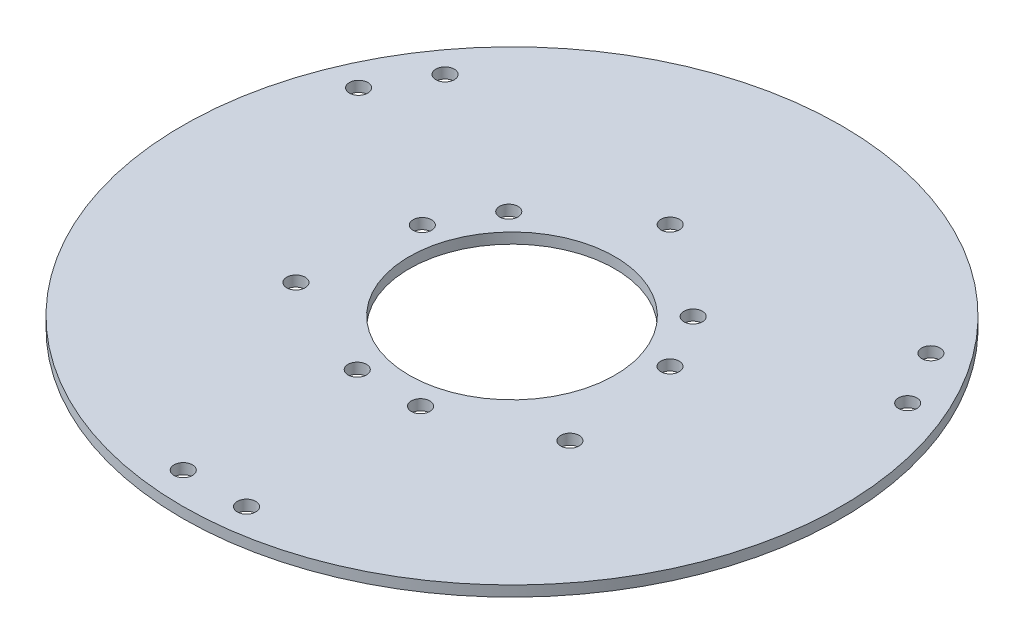
ISO-10303-21;
HEADER;
FILE_DESCRIPTION(('STEP AP214'),'2;1');
FILE_NAME('part.step','',(''),(''),'','','');
FILE_SCHEMA(('AUTOMOTIVE_DESIGN { 1 0 10303 214 1 1 1 1 }'));
ENDSEC;
DATA;
#1=APPLICATION_CONTEXT('core data for automotive mechanical design processes');
#2=APPLICATION_PROTOCOL_DEFINITION('international standard','automotive_design',2000,#1);
#3=PRODUCT_CONTEXT('',#1,'mechanical');
#4=PRODUCT('Part','Part','',(#3));
#5=PRODUCT_RELATED_PRODUCT_CATEGORY('part','',(#4));
#6=PRODUCT_DEFINITION_FORMATION('','',#4);
#7=PRODUCT_DEFINITION_CONTEXT('part definition',#1,'design');
#8=PRODUCT_DEFINITION('design','',#6,#7);
#9=PRODUCT_DEFINITION_SHAPE('','',#8);
#10=(LENGTH_UNIT() NAMED_UNIT(*) SI_UNIT(.MILLI.,.METRE.));
#11=(NAMED_UNIT(*) PLANE_ANGLE_UNIT() SI_UNIT($,.RADIAN.));
#12=(NAMED_UNIT(*) SI_UNIT($,.STERADIAN.) SOLID_ANGLE_UNIT());
#13=UNCERTAINTY_MEASURE_WITH_UNIT(LENGTH_MEASURE(1.E-05),#10,'distance_accuracy_value','');
#14=(GEOMETRIC_REPRESENTATION_CONTEXT(3) GLOBAL_UNCERTAINTY_ASSIGNED_CONTEXT((#13)) GLOBAL_UNIT_ASSIGNED_CONTEXT((#10,
#11,#12)) REPRESENTATION_CONTEXT('',''));
#15=CARTESIAN_POINT('',(0.,0.,0.));
#16=DIRECTION('',(0.,0.,1.));
#17=DIRECTION('',(1.,0.,0.));
#18=AXIS2_PLACEMENT_3D('',#15,#16,#17);
#19=CARTESIAN_POINT('',(6.15369130881944,2.,23.5));
#20=DIRECTION('',(0.,-1.,0.));
#21=DIRECTION('',(0.,0.,-1.));
#22=AXIS2_PLACEMENT_3D('',#19,#20,#21);
#23=CYLINDRICAL_SURFACE('',#22,1.74999999999999);
#24=CARTESIAN_POINT('',(6.15369130881944,2.,23.5));
#25=DIRECTION('',(0.,1.,0.));
#26=DIRECTION('',(0.,0.,1.));
#27=AXIS2_PLACEMENT_3D('',#24,#25,#26);
#28=CIRCLE('',#27,1.74999999999999);
#29=CARTESIAN_POINT('',(6.15369130881944,2.,25.25));
#30=VERTEX_POINT('',#29);
#31=EDGE_CURVE('E49',#30,#30,#28,.T.);
#32=ORIENTED_EDGE('',*,*,#31,.T.);
#33=EDGE_LOOP('',(#32));
#34=FACE_BOUND('',#33,.T.);
#35=CARTESIAN_POINT('',(6.15369130881944,0.,23.5));
#36=DIRECTION('',(0.,1.,0.));
#37=DIRECTION('',(0.,0.,1.));
#38=AXIS2_PLACEMENT_3D('',#35,#36,#37);
#39=CIRCLE('',#38,1.74999999999999);
#40=CARTESIAN_POINT('',(6.15369130881944,0.,25.25));
#41=VERTEX_POINT('',#40);
#42=EDGE_CURVE('E102',#41,#41,#39,.T.);
#43=ORIENTED_EDGE('',*,*,#42,.F.);
#44=EDGE_LOOP('',(#43));
#45=FACE_BOUND('',#44,.T.);
#46=ADVANCED_FACE('F41',(#34,#45),#23,.F.);
#47=CARTESIAN_POINT('',(-5.84630869118055,2.,23.5));
#48=DIRECTION('',(0.,-1.,0.));
#49=DIRECTION('',(0.,0.,-1.));
#50=AXIS2_PLACEMENT_3D('',#47,#48,#49);
#51=CYLINDRICAL_SURFACE('',#50,1.74999999999999);
#52=CARTESIAN_POINT('',(-5.84630869118055,2.,23.5));
#53=DIRECTION('',(0.,1.,0.));
#54=DIRECTION('',(0.,0.,1.));
#55=AXIS2_PLACEMENT_3D('',#52,#53,#54);
#56=CIRCLE('',#55,1.74999999999999);
#57=CARTESIAN_POINT('',(-5.84630869118055,2.,25.25));
#58=VERTEX_POINT('',#57);
#59=EDGE_CURVE('E54',#58,#58,#56,.T.);
#60=ORIENTED_EDGE('',*,*,#59,.T.);
#61=EDGE_LOOP('',(#60));
#62=FACE_BOUND('',#61,.T.);
#63=CARTESIAN_POINT('',(-5.84630869118055,0.,23.5));
#64=DIRECTION('',(0.,1.,0.));
#65=DIRECTION('',(0.,0.,1.));
#66=AXIS2_PLACEMENT_3D('',#63,#64,#65);
#67=CIRCLE('',#66,1.74999999999999);
#68=CARTESIAN_POINT('',(-5.84630869118055,0.,25.25));
#69=VERTEX_POINT('',#68);
#70=EDGE_CURVE('E100',#69,#69,#67,.T.);
#71=ORIENTED_EDGE('',*,*,#70,.F.);
#72=EDGE_LOOP('',(#71));
#73=FACE_BOUND('',#72,.T.);
#74=ADVANCED_FACE('F156',(#62,#73),#51,.F.);
#75=CARTESIAN_POINT('',(6.15369130881945,2.,56.5));
#76=DIRECTION('',(0.,-1.,0.));
#77=DIRECTION('',(0.,0.,-1.));
#78=AXIS2_PLACEMENT_3D('',#75,#76,#77);
#79=CYLINDRICAL_SURFACE('',#78,1.75);
#80=CARTESIAN_POINT('',(6.15369130881945,2.,56.5));
#81=DIRECTION('',(0.,1.,0.));
#82=DIRECTION('',(0.,0.,1.));
#83=AXIS2_PLACEMENT_3D('',#80,#81,#82);
#84=CIRCLE('',#83,1.75);
#85=CARTESIAN_POINT('',(6.15369130881945,2.,58.25));
#86=VERTEX_POINT('',#85);
#87=EDGE_CURVE('E151',#86,#86,#84,.T.);
#88=ORIENTED_EDGE('',*,*,#87,.T.);
#89=EDGE_LOOP('',(#88));
#90=FACE_BOUND('',#89,.T.);
#91=CARTESIAN_POINT('',(6.15369130881945,0.,56.5));
#92=DIRECTION('',(0.,1.,0.));
#93=DIRECTION('',(0.,0.,1.));
#94=AXIS2_PLACEMENT_3D('',#91,#92,#93);
#95=CIRCLE('',#94,1.75);
#96=CARTESIAN_POINT('',(6.15369130881945,0.,58.25));
#97=VERTEX_POINT('',#96);
#98=EDGE_CURVE('E97',#97,#97,#95,.T.);
#99=ORIENTED_EDGE('',*,*,#98,.F.);
#100=EDGE_LOOP('',(#99));
#101=FACE_BOUND('',#100,.T.);
#102=ADVANCED_FACE('F174',(#90,#101),#79,.F.);
#103=CARTESIAN_POINT('',(-5.84630869118055,2.,56.5));
#104=DIRECTION('',(0.,-1.,0.));
#105=DIRECTION('',(0.,0.,-1.));
#106=AXIS2_PLACEMENT_3D('',#103,#104,#105);
#107=CYLINDRICAL_SURFACE('',#106,1.74999999999999);
#108=CARTESIAN_POINT('',(-5.84630869118055,2.,56.5));
#109=DIRECTION('',(0.,1.,0.));
#110=DIRECTION('',(0.,0.,1.));
#111=AXIS2_PLACEMENT_3D('',#108,#109,#110);
#112=CIRCLE('',#111,1.74999999999999);
#113=CARTESIAN_POINT('',(-5.84630869118055,2.,58.25));
#114=VERTEX_POINT('',#113);
#115=EDGE_CURVE('E148',#114,#114,#112,.T.);
#116=ORIENTED_EDGE('',*,*,#115,.T.);
#117=EDGE_LOOP('',(#116));
#118=FACE_BOUND('',#117,.T.);
#119=CARTESIAN_POINT('',(-5.84630869118055,0.,56.5));
#120=DIRECTION('',(0.,1.,0.));
#121=DIRECTION('',(0.,0.,1.));
#122=AXIS2_PLACEMENT_3D('',#119,#120,#121);
#123=CIRCLE('',#122,1.74999999999999);
#124=CARTESIAN_POINT('',(-5.84630869118055,0.,58.25));
#125=VERTEX_POINT('',#124);
#126=EDGE_CURVE('E94',#125,#125,#123,.T.);
#127=ORIENTED_EDGE('',*,*,#126,.F.);
#128=EDGE_LOOP('',(#127));
#129=FACE_BOUND('',#128,.T.);
#130=ADVANCED_FACE('F181',(#118,#129),#107,.F.);
#131=CARTESIAN_POINT('',(-46.0072809682304,2.,-33.3130518449283));
#132=DIRECTION('',(0.,-1.,0.));
#133=DIRECTION('',(0.,0.,-1.));
#134=AXIS2_PLACEMENT_3D('',#131,#132,#133);
#135=CYLINDRICAL_SURFACE('',#134,1.74999999999999);
#136=CARTESIAN_POINT('',(-46.0072809682304,2.,-33.3130518449283));
#137=DIRECTION('',(0.,1.,0.));
#138=DIRECTION('',(0.,0.,1.));
#139=AXIS2_PLACEMENT_3D('',#136,#137,#138);
#140=CIRCLE('',#139,1.74999999999999);
#141=CARTESIAN_POINT('',(-46.0072809682304,2.,-31.5630518449283));
#142=VERTEX_POINT('',#141);
#143=EDGE_CURVE('E145',#142,#142,#140,.T.);
#144=ORIENTED_EDGE('',*,*,#143,.T.);
#145=EDGE_LOOP('',(#144));
#146=FACE_BOUND('',#145,.T.);
#147=CARTESIAN_POINT('',(-46.0072809682304,0.,-33.3130518449283));
#148=DIRECTION('',(0.,1.,0.));
#149=DIRECTION('',(0.,0.,1.));
#150=AXIS2_PLACEMENT_3D('',#147,#148,#149);
#151=CIRCLE('',#150,1.74999999999999);
#152=CARTESIAN_POINT('',(-46.0072809682304,0.,-31.5630518449283));
#153=VERTEX_POINT('',#152);
#154=EDGE_CURVE('E91',#153,#153,#151,.T.);
#155=ORIENTED_EDGE('',*,*,#154,.F.);
#156=EDGE_LOOP('',(#155));
#157=FACE_BOUND('',#156,.T.);
#158=ADVANCED_FACE('F185',(#146,#157),#135,.F.);
#159=CARTESIAN_POINT('',(-23.428442643344,2.,-6.42074699951495));
#160=DIRECTION('',(0.,-1.,0.));
#161=DIRECTION('',(0.,0.,-1.));
#162=AXIS2_PLACEMENT_3D('',#159,#160,#161);
#163=CYLINDRICAL_SURFACE('',#162,1.74999999999999);
#164=CARTESIAN_POINT('',(-23.428442643344,2.,-6.42074699951495));
#165=DIRECTION('',(0.,1.,0.));
#166=DIRECTION('',(0.,0.,1.));
#167=AXIS2_PLACEMENT_3D('',#164,#165,#166);
#168=CIRCLE('',#167,1.74999999999999);
#169=CARTESIAN_POINT('',(-23.428442643344,2.,-4.67074699951496));
#170=VERTEX_POINT('',#169);
#171=EDGE_CURVE('E142',#170,#170,#168,.T.);
#172=ORIENTED_EDGE('',*,*,#171,.T.);
#173=EDGE_LOOP('',(#172));
#174=FACE_BOUND('',#173,.T.);
#175=CARTESIAN_POINT('',(-23.428442643344,0.,-6.42074699951495));
#176=DIRECTION('',(0.,1.,0.));
#177=DIRECTION('',(0.,0.,1.));
#178=AXIS2_PLACEMENT_3D('',#175,#176,#177);
#179=CIRCLE('',#178,1.74999999999999);
#180=CARTESIAN_POINT('',(-23.428442643344,0.,-4.67074699951496));
#181=VERTEX_POINT('',#180);
#182=EDGE_CURVE('E88',#181,#181,#179,.T.);
#183=ORIENTED_EDGE('',*,*,#182,.F.);
#184=EDGE_LOOP('',(#183));
#185=FACE_BOUND('',#184,.T.);
#186=ADVANCED_FACE('F189',(#174,#185),#163,.F.);
#187=CARTESIAN_POINT('',(-17.4284426433439,2.,-16.8130518449282));
#188=DIRECTION('',(0.,-1.,0.));
#189=DIRECTION('',(0.,0.,-1.));
#190=AXIS2_PLACEMENT_3D('',#187,#188,#189);
#191=CYLINDRICAL_SURFACE('',#190,1.74999999999999);
#192=CARTESIAN_POINT('',(-17.4284426433439,2.,-16.8130518449282));
#193=DIRECTION('',(0.,1.,0.));
#194=DIRECTION('',(0.,0.,1.));
#195=AXIS2_PLACEMENT_3D('',#192,#193,#194);
#196=CIRCLE('',#195,1.74999999999999);
#197=CARTESIAN_POINT('',(-17.4284426433439,2.,-15.0630518449282));
#198=VERTEX_POINT('',#197);
#199=EDGE_CURVE('E139',#198,#198,#196,.T.);
#200=ORIENTED_EDGE('',*,*,#199,.T.);
#201=EDGE_LOOP('',(#200));
#202=FACE_BOUND('',#201,.T.);
#203=CARTESIAN_POINT('',(-17.4284426433439,0.,-16.8130518449282));
#204=DIRECTION('',(0.,1.,0.));
#205=DIRECTION('',(0.,0.,1.));
#206=AXIS2_PLACEMENT_3D('',#203,#204,#205);
#207=CIRCLE('',#206,1.74999999999999);
#208=CARTESIAN_POINT('',(-17.4284426433439,0.,-15.0630518449282));
#209=VERTEX_POINT('',#208);
#210=EDGE_CURVE('E85',#209,#209,#207,.T.);
#211=ORIENTED_EDGE('',*,*,#210,.F.);
#212=EDGE_LOOP('',(#211));
#213=FACE_BOUND('',#212,.T.);
#214=ADVANCED_FACE('F193',(#202,#213),#191,.F.);
#215=CARTESIAN_POINT('',(-52.0072809682304,2.,-22.9207469995151));
#216=DIRECTION('',(0.,-1.,0.));
#217=DIRECTION('',(0.,0.,-1.));
#218=AXIS2_PLACEMENT_3D('',#215,#216,#217);
#219=CYLINDRICAL_SURFACE('',#218,1.74999999999999);
#220=CARTESIAN_POINT('',(-52.0072809682304,2.,-22.9207469995151));
#221=DIRECTION('',(0.,1.,0.));
#222=DIRECTION('',(0.,0.,1.));
#223=AXIS2_PLACEMENT_3D('',#220,#221,#222);
#224=CIRCLE('',#223,1.74999999999999);
#225=CARTESIAN_POINT('',(-52.0072809682304,2.,-21.1707469995151));
#226=VERTEX_POINT('',#225);
#227=EDGE_CURVE('E136',#226,#226,#224,.T.);
#228=ORIENTED_EDGE('',*,*,#227,.T.);
#229=EDGE_LOOP('',(#228));
#230=FACE_BOUND('',#229,.T.);
#231=CARTESIAN_POINT('',(-52.0072809682304,0.,-22.9207469995151));
#232=DIRECTION('',(0.,1.,0.));
#233=DIRECTION('',(0.,0.,1.));
#234=AXIS2_PLACEMENT_3D('',#231,#232,#233);
#235=CIRCLE('',#234,1.74999999999999);
#236=CARTESIAN_POINT('',(-52.0072809682304,0.,-21.1707469995151));
#237=VERTEX_POINT('',#236);
#238=EDGE_CURVE('E82',#237,#237,#235,.T.);
#239=ORIENTED_EDGE('',*,*,#238,.F.);
#240=EDGE_LOOP('',(#239));
#241=FACE_BOUND('',#240,.T.);
#242=ADVANCED_FACE('F197',(#230,#241),#219,.F.);
#243=CARTESIAN_POINT('',(51.8535896594113,2.,-23.1869481550714));
#244=DIRECTION('',(0.,-1.,0.));
#245=DIRECTION('',(0.,0.,-1.));
#246=AXIS2_PLACEMENT_3D('',#243,#244,#245);
#247=CYLINDRICAL_SURFACE('',#246,1.74999999999999);
#248=CARTESIAN_POINT('',(51.8535896594113,2.,-23.1869481550714));
#249=DIRECTION('',(0.,1.,0.));
#250=DIRECTION('',(0.,0.,1.));
#251=AXIS2_PLACEMENT_3D('',#248,#249,#250);
#252=CIRCLE('',#251,1.74999999999999);
#253=CARTESIAN_POINT('',(51.8535896594113,2.,-21.4369481550714));
#254=VERTEX_POINT('',#253);
#255=EDGE_CURVE('E133',#254,#254,#252,.T.);
#256=ORIENTED_EDGE('',*,*,#255,.T.);
#257=EDGE_LOOP('',(#256));
#258=FACE_BOUND('',#257,.T.);
#259=CARTESIAN_POINT('',(51.8535896594113,0.,-23.1869481550714));
#260=DIRECTION('',(0.,1.,0.));
#261=DIRECTION('',(0.,0.,1.));
#262=AXIS2_PLACEMENT_3D('',#259,#260,#261);
#263=CIRCLE('',#262,1.74999999999999);
#264=CARTESIAN_POINT('',(51.8535896594113,0.,-21.4369481550714));
#265=VERTEX_POINT('',#264);
#266=EDGE_CURVE('E79',#265,#265,#263,.T.);
#267=ORIENTED_EDGE('',*,*,#266,.F.);
#268=EDGE_LOOP('',(#267));
#269=FACE_BOUND('',#268,.T.);
#270=ADVANCED_FACE('F201',(#258,#269),#247,.F.);
#271=CARTESIAN_POINT('',(17.2747513345247,2.,-17.079253000485));
#272=DIRECTION('',(0.,-1.,0.));
#273=DIRECTION('',(0.,0.,-1.));
#274=AXIS2_PLACEMENT_3D('',#271,#272,#273);
#275=CYLINDRICAL_SURFACE('',#274,1.74999999999999);
#276=CARTESIAN_POINT('',(17.2747513345247,2.,-17.079253000485));
#277=DIRECTION('',(0.,1.,0.));
#278=DIRECTION('',(0.,0.,1.));
#279=AXIS2_PLACEMENT_3D('',#276,#277,#278);
#280=CIRCLE('',#279,1.74999999999999);
#281=CARTESIAN_POINT('',(17.2747513345247,2.,-15.329253000485));
#282=VERTEX_POINT('',#281);
#283=EDGE_CURVE('E130',#282,#282,#280,.T.);
#284=ORIENTED_EDGE('',*,*,#283,.T.);
#285=EDGE_LOOP('',(#284));
#286=FACE_BOUND('',#285,.T.);
#287=CARTESIAN_POINT('',(17.2747513345247,0.,-17.079253000485));
#288=DIRECTION('',(0.,1.,0.));
#289=DIRECTION('',(0.,0.,1.));
#290=AXIS2_PLACEMENT_3D('',#287,#288,#289);
#291=CIRCLE('',#290,1.74999999999999);
#292=CARTESIAN_POINT('',(17.2747513345247,0.,-15.329253000485));
#293=VERTEX_POINT('',#292);
#294=EDGE_CURVE('E76',#293,#293,#291,.T.);
#295=ORIENTED_EDGE('',*,*,#294,.F.);
#296=EDGE_LOOP('',(#295));
#297=FACE_BOUND('',#296,.T.);
#298=ADVANCED_FACE('F205',(#286,#297),#275,.F.);
#299=CARTESIAN_POINT('',(23.2747513345246,2.,-6.68694815507167));
#300=DIRECTION('',(0.,-1.,0.));
#301=DIRECTION('',(0.,0.,-1.));
#302=AXIS2_PLACEMENT_3D('',#299,#300,#301);
#303=CYLINDRICAL_SURFACE('',#302,1.74999999999999);
#304=CARTESIAN_POINT('',(23.2747513345246,2.,-6.68694815507167));
#305=DIRECTION('',(0.,1.,0.));
#306=DIRECTION('',(0.,0.,1.));
#307=AXIS2_PLACEMENT_3D('',#304,#305,#306);
#308=CIRCLE('',#307,1.74999999999999);
#309=CARTESIAN_POINT('',(23.2747513345246,2.,-4.93694815507168));
#310=VERTEX_POINT('',#309);
#311=EDGE_CURVE('E127',#310,#310,#308,.T.);
#312=ORIENTED_EDGE('',*,*,#311,.T.);
#313=EDGE_LOOP('',(#312));
#314=FACE_BOUND('',#313,.T.);
#315=CARTESIAN_POINT('',(23.2747513345246,0.,-6.68694815507167));
#316=DIRECTION('',(0.,1.,0.));
#317=DIRECTION('',(0.,0.,1.));
#318=AXIS2_PLACEMENT_3D('',#315,#316,#317);
#319=CIRCLE('',#318,1.74999999999999);
#320=CARTESIAN_POINT('',(23.2747513345246,0.,-4.93694815507168));
#321=VERTEX_POINT('',#320);
#322=EDGE_CURVE('E73',#321,#321,#319,.T.);
#323=ORIENTED_EDGE('',*,*,#322,.F.);
#324=EDGE_LOOP('',(#323));
#325=FACE_BOUND('',#324,.T.);
#326=ADVANCED_FACE('F209',(#314,#325),#303,.F.);
#327=CARTESIAN_POINT('',(45.8535896594114,2.,-33.5792530004847));
#328=DIRECTION('',(0.,-1.,0.));
#329=DIRECTION('',(0.,0.,-1.));
#330=AXIS2_PLACEMENT_3D('',#327,#328,#329);
#331=CYLINDRICAL_SURFACE('',#330,1.75);
#332=CARTESIAN_POINT('',(45.8535896594114,2.,-33.5792530004847));
#333=DIRECTION('',(0.,1.,0.));
#334=DIRECTION('',(0.,0.,1.));
#335=AXIS2_PLACEMENT_3D('',#332,#333,#334);
#336=CIRCLE('',#335,1.75);
#337=CARTESIAN_POINT('',(45.8535896594114,2.,-31.8292530004847));
#338=VERTEX_POINT('',#337);
#339=EDGE_CURVE('E124',#338,#338,#336,.T.);
#340=ORIENTED_EDGE('',*,*,#339,.T.);
#341=EDGE_LOOP('',(#340));
#342=FACE_BOUND('',#341,.T.);
#343=CARTESIAN_POINT('',(45.8535896594114,0.,-33.5792530004847));
#344=DIRECTION('',(0.,1.,0.));
#345=DIRECTION('',(0.,0.,1.));
#346=AXIS2_PLACEMENT_3D('',#343,#344,#345);
#347=CIRCLE('',#346,1.75);
#348=CARTESIAN_POINT('',(45.8535896594114,0.,-31.8292530004847));
#349=VERTEX_POINT('',#348);
#350=EDGE_CURVE('E70',#349,#349,#347,.T.);
#351=ORIENTED_EDGE('',*,*,#350,.F.);
#352=EDGE_LOOP('',(#351));
#353=FACE_BOUND('',#352,.T.);
#354=ADVANCED_FACE('F213',(#342,#353),#331,.F.);
#355=CARTESIAN_POINT('',(0.,2.,0.));
#356=DIRECTION('',(0.,-1.,0.));
#357=DIRECTION('',(0.,0.,-1.));
#358=AXIS2_PLACEMENT_3D('',#355,#356,#357);
#359=CYLINDRICAL_SURFACE('',#358,19.5);
#360=CARTESIAN_POINT('',(0.,2.,0.));
#361=DIRECTION('',(0.,1.,0.));
#362=DIRECTION('',(0.,0.,1.));
#363=AXIS2_PLACEMENT_3D('',#360,#361,#362);
#364=CIRCLE('',#363,19.5);
#365=CARTESIAN_POINT('',(0.,2.,19.5));
#366=VERTEX_POINT('',#365);
#367=EDGE_CURVE('E121',#366,#366,#364,.T.);
#368=ORIENTED_EDGE('',*,*,#367,.T.);
#369=EDGE_LOOP('',(#368));
#370=FACE_BOUND('',#369,.T.);
#371=CARTESIAN_POINT('',(0.,0.,0.));
#372=DIRECTION('',(0.,1.,0.));
#373=DIRECTION('',(0.,0.,1.));
#374=AXIS2_PLACEMENT_3D('',#371,#372,#373);
#375=CIRCLE('',#374,19.5);
#376=CARTESIAN_POINT('',(0.,0.,19.5));
#377=VERTEX_POINT('',#376);
#378=EDGE_CURVE('E67',#377,#377,#375,.T.);
#379=ORIENTED_EDGE('',*,*,#378,.F.);
#380=EDGE_LOOP('',(#379));
#381=FACE_BOUND('',#380,.T.);
#382=ADVANCED_FACE('F217',(#370,#381),#359,.F.);
#383=CARTESIAN_POINT('',(0.,2.,-30.));
#384=DIRECTION('',(0.,-1.,0.));
#385=DIRECTION('',(0.,0.,-1.));
#386=AXIS2_PLACEMENT_3D('',#383,#384,#385);
#387=CYLINDRICAL_SURFACE('',#386,1.75);
#388=CARTESIAN_POINT('',(0.,2.,-30.));
#389=DIRECTION('',(0.,1.,0.));
#390=DIRECTION('',(0.,0.,1.));
#391=AXIS2_PLACEMENT_3D('',#388,#389,#390);
#392=CIRCLE('',#391,1.75);
#393=CARTESIAN_POINT('',(0.,2.,-28.25));
#394=VERTEX_POINT('',#393);
#395=EDGE_CURVE('E116',#394,#394,#392,.T.);
#396=ORIENTED_EDGE('',*,*,#395,.T.);
#397=EDGE_LOOP('',(#396));
#398=FACE_BOUND('',#397,.T.);
#399=CARTESIAN_POINT('',(0.,0.,-30.));
#400=DIRECTION('',(0.,1.,0.));
#401=DIRECTION('',(0.,0.,1.));
#402=AXIS2_PLACEMENT_3D('',#399,#400,#401);
#403=CIRCLE('',#402,1.75);
#404=CARTESIAN_POINT('',(0.,0.,-28.25));
#405=VERTEX_POINT('',#404);
#406=EDGE_CURVE('E64',#405,#405,#403,.T.);
#407=ORIENTED_EDGE('',*,*,#406,.F.);
#408=EDGE_LOOP('',(#407));
#409=FACE_BOUND('',#408,.T.);
#410=ADVANCED_FACE('F221',(#398,#409),#387,.F.);
#411=CARTESIAN_POINT('',(25.9807621135351,2.,14.9999999999989));
#412=DIRECTION('',(0.,-1.,0.));
#413=DIRECTION('',(0.,0.,-1.));
#414=AXIS2_PLACEMENT_3D('',#411,#412,#413);
#415=CYLINDRICAL_SURFACE('',#414,1.75000000000165);
#416=CARTESIAN_POINT('',(25.9807621135351,2.,14.9999999999989));
#417=DIRECTION('',(0.,1.,0.));
#418=DIRECTION('',(0.,0.,1.));
#419=AXIS2_PLACEMENT_3D('',#416,#417,#418);
#420=CIRCLE('',#419,1.75000000000165);
#421=CARTESIAN_POINT('',(25.9807621135351,2.,16.7500000000005));
#422=VERTEX_POINT('',#421);
#423=EDGE_CURVE('E111',#422,#422,#420,.T.);
#424=ORIENTED_EDGE('',*,*,#423,.T.);
#425=EDGE_LOOP('',(#424));
#426=FACE_BOUND('',#425,.T.);
#427=CARTESIAN_POINT('',(25.9807621135351,0.,14.9999999999989));
#428=DIRECTION('',(0.,1.,0.));
#429=DIRECTION('',(0.,0.,1.));
#430=AXIS2_PLACEMENT_3D('',#427,#428,#429);
#431=CIRCLE('',#430,1.75000000000165);
#432=CARTESIAN_POINT('',(25.9807621135351,0.,16.7500000000005));
#433=VERTEX_POINT('',#432);
#434=EDGE_CURVE('E61',#433,#433,#431,.T.);
#435=ORIENTED_EDGE('',*,*,#434,.F.);
#436=EDGE_LOOP('',(#435));
#437=FACE_BOUND('',#436,.T.);
#438=ADVANCED_FACE('F224',(#426,#437),#415,.F.);
#439=CARTESIAN_POINT('',(-25.9807621135312,2.,15.0000000000011));
#440=DIRECTION('',(0.,-1.,0.));
#441=DIRECTION('',(0.,0.,-1.));
#442=AXIS2_PLACEMENT_3D('',#439,#440,#441);
#443=CYLINDRICAL_SURFACE('',#442,1.75000000000243);
#444=CARTESIAN_POINT('',(-25.9807621135312,2.,15.0000000000011));
#445=DIRECTION('',(0.,1.,0.));
#446=DIRECTION('',(0.,0.,1.));
#447=AXIS2_PLACEMENT_3D('',#444,#445,#446);
#448=CIRCLE('',#447,1.75000000000243);
#449=CARTESIAN_POINT('',(-25.9807621135312,2.,16.7500000000035));
#450=VERTEX_POINT('',#449);
#451=EDGE_CURVE('E107',#450,#450,#448,.T.);
#452=ORIENTED_EDGE('',*,*,#451,.T.);
#453=EDGE_LOOP('',(#452));
#454=FACE_BOUND('',#453,.T.);
#455=CARTESIAN_POINT('',(-25.9807621135312,0.,15.0000000000011));
#456=DIRECTION('',(0.,1.,0.));
#457=DIRECTION('',(0.,0.,1.));
#458=AXIS2_PLACEMENT_3D('',#455,#456,#457);
#459=CIRCLE('',#458,1.75000000000243);
#460=CARTESIAN_POINT('',(-25.9807621135312,0.,16.7500000000035));
#461=VERTEX_POINT('',#460);
#462=EDGE_CURVE('E58',#461,#461,#459,.T.);
#463=ORIENTED_EDGE('',*,*,#462,.F.);
#464=EDGE_LOOP('',(#463));
#465=FACE_BOUND('',#464,.T.);
#466=ADVANCED_FACE('F43',(#454,#465),#443,.F.);
#467=CARTESIAN_POINT('',(0.,2.,0.));
#468=DIRECTION('',(0.,-1.,0.));
#469=DIRECTION('',(0.,0.,-1.));
#470=AXIS2_PLACEMENT_3D('',#467,#468,#469);
#471=CYLINDRICAL_SURFACE('',#470,62.5);
#472=CARTESIAN_POINT('',(0.,2.,0.));
#473=DIRECTION('',(0.,1.,0.));
#474=DIRECTION('',(0.,0.,1.));
#475=AXIS2_PLACEMENT_3D('',#472,#473,#474);
#476=CIRCLE('',#475,62.5);
#477=CARTESIAN_POINT('',(0.,2.,62.5));
#478=VERTEX_POINT('',#477);
#479=EDGE_CURVE('E10',#478,#478,#476,.T.);
#480=ORIENTED_EDGE('',*,*,#479,.F.);
#481=EDGE_LOOP('',(#480));
#482=FACE_BOUND('',#481,.T.);
#483=CARTESIAN_POINT('',(0.,0.,0.));
#484=DIRECTION('',(0.,1.,0.));
#485=DIRECTION('',(0.,0.,1.));
#486=AXIS2_PLACEMENT_3D('',#483,#484,#485);
#487=CIRCLE('',#486,62.5);
#488=CARTESIAN_POINT('',(0.,0.,62.5));
#489=VERTEX_POINT('',#488);
#490=EDGE_CURVE('E45',#489,#489,#487,.T.);
#491=ORIENTED_EDGE('',*,*,#490,.T.);
#492=EDGE_LOOP('',(#491));
#493=FACE_BOUND('',#492,.T.);
#494=ADVANCED_FACE('F163',(#482,#493),#471,.T.);
#495=CARTESIAN_POINT('',(0.,2.,0.));
#496=DIRECTION('',(0.,1.,0.));
#497=DIRECTION('',(0.,0.,1.));
#498=AXIS2_PLACEMENT_3D('',#495,#496,#497);
#499=PLANE('',#498);
#500=ORIENTED_EDGE('',*,*,#451,.F.);
#501=EDGE_LOOP('',(#500));
#502=FACE_BOUND('',#501,.T.);
#503=ORIENTED_EDGE('',*,*,#423,.F.);
#504=EDGE_LOOP('',(#503));
#505=FACE_BOUND('',#504,.T.);
#506=ORIENTED_EDGE('',*,*,#395,.F.);
#507=EDGE_LOOP('',(#506));
#508=FACE_BOUND('',#507,.T.);
#509=ORIENTED_EDGE('',*,*,#367,.F.);
#510=EDGE_LOOP('',(#509));
#511=FACE_BOUND('',#510,.T.);
#512=ORIENTED_EDGE('',*,*,#339,.F.);
#513=EDGE_LOOP('',(#512));
#514=FACE_BOUND('',#513,.T.);
#515=ORIENTED_EDGE('',*,*,#311,.F.);
#516=EDGE_LOOP('',(#515));
#517=FACE_BOUND('',#516,.T.);
#518=ORIENTED_EDGE('',*,*,#283,.F.);
#519=EDGE_LOOP('',(#518));
#520=FACE_BOUND('',#519,.T.);
#521=ORIENTED_EDGE('',*,*,#255,.F.);
#522=EDGE_LOOP('',(#521));
#523=FACE_BOUND('',#522,.T.);
#524=ORIENTED_EDGE('',*,*,#227,.F.);
#525=EDGE_LOOP('',(#524));
#526=FACE_BOUND('',#525,.T.);
#527=ORIENTED_EDGE('',*,*,#199,.F.);
#528=EDGE_LOOP('',(#527));
#529=FACE_BOUND('',#528,.T.);
#530=ORIENTED_EDGE('',*,*,#171,.F.);
#531=EDGE_LOOP('',(#530));
#532=FACE_BOUND('',#531,.T.);
#533=ORIENTED_EDGE('',*,*,#143,.F.);
#534=EDGE_LOOP('',(#533));
#535=FACE_BOUND('',#534,.T.);
#536=ORIENTED_EDGE('',*,*,#115,.F.);
#537=EDGE_LOOP('',(#536));
#538=FACE_BOUND('',#537,.T.);
#539=ORIENTED_EDGE('',*,*,#87,.F.);
#540=EDGE_LOOP('',(#539));
#541=FACE_BOUND('',#540,.T.);
#542=ORIENTED_EDGE('',*,*,#59,.F.);
#543=EDGE_LOOP('',(#542));
#544=FACE_BOUND('',#543,.T.);
#545=ORIENTED_EDGE('',*,*,#31,.F.);
#546=EDGE_LOOP('',(#545));
#547=FACE_BOUND('',#546,.T.);
#548=ORIENTED_EDGE('',*,*,#479,.T.);
#549=EDGE_LOOP('',(#548));
#550=FACE_BOUND('',#549,.T.);
#551=ADVANCED_FACE('F159',(#502,#505,#508,#511,#514,#517,#520,#523,#526,#529,#532,#535,#538,
#541,#544,#547,#550),#499,.T.);
#552=CARTESIAN_POINT('',(0.,0.,0.));
#553=DIRECTION('',(0.,1.,0.));
#554=DIRECTION('',(0.,0.,1.));
#555=AXIS2_PLACEMENT_3D('',#552,#553,#554);
#556=PLANE('',#555);
#557=ORIENTED_EDGE('',*,*,#462,.T.);
#558=EDGE_LOOP('',(#557));
#559=FACE_BOUND('',#558,.T.);
#560=ORIENTED_EDGE('',*,*,#434,.T.);
#561=EDGE_LOOP('',(#560));
#562=FACE_BOUND('',#561,.T.);
#563=ORIENTED_EDGE('',*,*,#406,.T.);
#564=EDGE_LOOP('',(#563));
#565=FACE_BOUND('',#564,.T.);
#566=ORIENTED_EDGE('',*,*,#378,.T.);
#567=EDGE_LOOP('',(#566));
#568=FACE_BOUND('',#567,.T.);
#569=ORIENTED_EDGE('',*,*,#350,.T.);
#570=EDGE_LOOP('',(#569));
#571=FACE_BOUND('',#570,.T.);
#572=ORIENTED_EDGE('',*,*,#322,.T.);
#573=EDGE_LOOP('',(#572));
#574=FACE_BOUND('',#573,.T.);
#575=ORIENTED_EDGE('',*,*,#294,.T.);
#576=EDGE_LOOP('',(#575));
#577=FACE_BOUND('',#576,.T.);
#578=ORIENTED_EDGE('',*,*,#266,.T.);
#579=EDGE_LOOP('',(#578));
#580=FACE_BOUND('',#579,.T.);
#581=ORIENTED_EDGE('',*,*,#238,.T.);
#582=EDGE_LOOP('',(#581));
#583=FACE_BOUND('',#582,.T.);
#584=ORIENTED_EDGE('',*,*,#210,.T.);
#585=EDGE_LOOP('',(#584));
#586=FACE_BOUND('',#585,.T.);
#587=ORIENTED_EDGE('',*,*,#182,.T.);
#588=EDGE_LOOP('',(#587));
#589=FACE_BOUND('',#588,.T.);
#590=ORIENTED_EDGE('',*,*,#154,.T.);
#591=EDGE_LOOP('',(#590));
#592=FACE_BOUND('',#591,.T.);
#593=ORIENTED_EDGE('',*,*,#126,.T.);
#594=EDGE_LOOP('',(#593));
#595=FACE_BOUND('',#594,.T.);
#596=ORIENTED_EDGE('',*,*,#98,.T.);
#597=EDGE_LOOP('',(#596));
#598=FACE_BOUND('',#597,.T.);
#599=ORIENTED_EDGE('',*,*,#70,.T.);
#600=EDGE_LOOP('',(#599));
#601=FACE_BOUND('',#600,.T.);
#602=ORIENTED_EDGE('',*,*,#42,.T.);
#603=EDGE_LOOP('',(#602));
#604=FACE_BOUND('',#603,.T.);
#605=ORIENTED_EDGE('',*,*,#490,.F.);
#606=EDGE_LOOP('',(#605));
#607=FACE_BOUND('',#606,.T.);
#608=ADVANCED_FACE('F162',(#559,#562,#565,#568,#571,#574,#577,#580,#583,#586,#589,#592,#595,
#598,#601,#604,#607),#556,.F.);
#609=CLOSED_SHELL('',(#46,#74,#102,#130,#158,#186,#214,#242,#270,#298,#326,#354,#382,#410,#438,
#466,#494,#551,#608));
#610=MANIFOLD_SOLID_BREP('B2',#609);
#611=ADVANCED_BREP_SHAPE_REPRESENTATION('',(#18,#610),#14);
#612=SHAPE_DEFINITION_REPRESENTATION(#9,#611);
ENDSEC;
END-ISO-10303-21;
